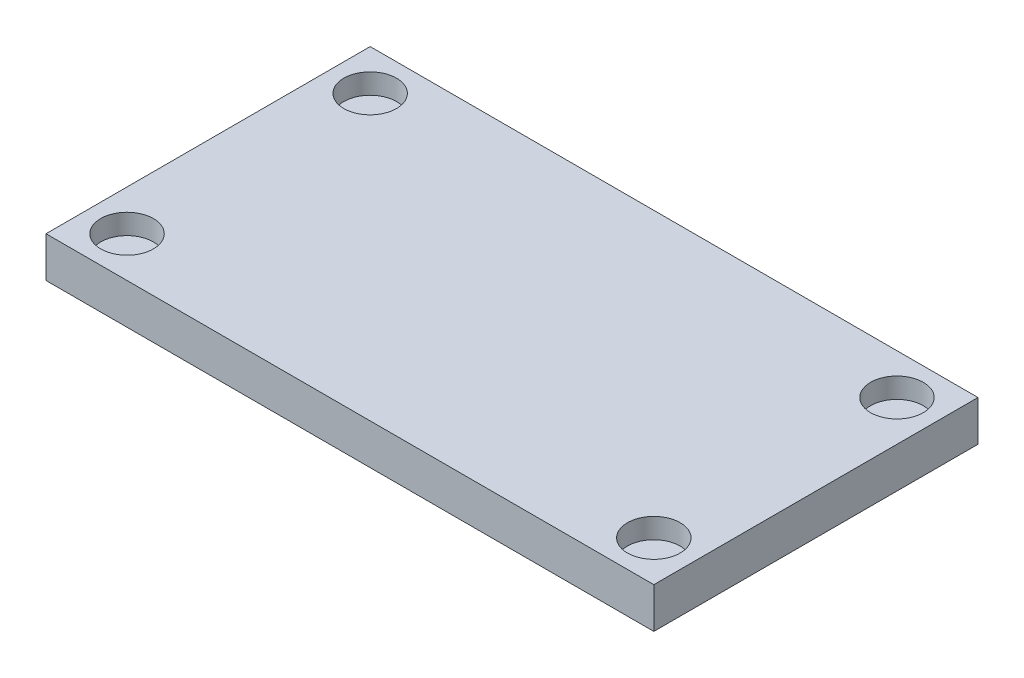
ISO-10303-21;
HEADER;
FILE_DESCRIPTION(('STEP AP214'),'2;1');
FILE_NAME('part.step','',(''),(''),'','','');
FILE_SCHEMA(('AUTOMOTIVE_DESIGN { 1 0 10303 214 1 1 1 1 }'));
ENDSEC;
DATA;
#1=APPLICATION_CONTEXT('core data for automotive mechanical design processes');
#2=APPLICATION_PROTOCOL_DEFINITION('international standard','automotive_design',2000,#1);
#3=PRODUCT_CONTEXT('',#1,'mechanical');
#4=PRODUCT('Part','Part','',(#3));
#5=PRODUCT_RELATED_PRODUCT_CATEGORY('part','',(#4));
#6=PRODUCT_DEFINITION_FORMATION('','',#4);
#7=PRODUCT_DEFINITION_CONTEXT('part definition',#1,'design');
#8=PRODUCT_DEFINITION('design','',#6,#7);
#9=PRODUCT_DEFINITION_SHAPE('','',#8);
#10=(LENGTH_UNIT() NAMED_UNIT(*) SI_UNIT(.MILLI.,.METRE.));
#11=(NAMED_UNIT(*) PLANE_ANGLE_UNIT() SI_UNIT($,.RADIAN.));
#12=(NAMED_UNIT(*) SI_UNIT($,.STERADIAN.) SOLID_ANGLE_UNIT());
#13=UNCERTAINTY_MEASURE_WITH_UNIT(LENGTH_MEASURE(1.E-05),#10,'distance_accuracy_value','');
#14=(GEOMETRIC_REPRESENTATION_CONTEXT(3) GLOBAL_UNCERTAINTY_ASSIGNED_CONTEXT((#13)) GLOBAL_UNIT_ASSIGNED_CONTEXT((#10,
#11,#12)) REPRESENTATION_CONTEXT('',''));
#15=CARTESIAN_POINT('',(0.,0.,0.));
#16=DIRECTION('',(0.,0.,1.));
#17=DIRECTION('',(1.,0.,0.));
#18=AXIS2_PLACEMENT_3D('',#15,#16,#17);
#19=CARTESIAN_POINT('',(0.,10.,0.));
#20=DIRECTION('',(0.,-1.,0.));
#21=DIRECTION('',(0.,0.,-1.));
#22=AXIS2_PLACEMENT_3D('',#19,#20,#21);
#23=PLANE('',#22);
#24=CARTESIAN_POINT('',(140.,10.,-70.));
#25=DIRECTION('',(0.,1.,0.));
#26=DIRECTION('',(0.,0.,1.));
#27=AXIS2_PLACEMENT_3D('',#24,#25,#26);
#28=CIRCLE('',#27,6.50000000000002);
#29=CARTESIAN_POINT('',(140.,10.,-63.5));
#30=VERTEX_POINT('',#29);
#31=EDGE_CURVE('E135',#30,#30,#28,.T.);
#32=ORIENTED_EDGE('',*,*,#31,.F.);
#33=EDGE_LOOP('',(#32));
#34=FACE_BOUND('',#33,.T.);
#35=CARTESIAN_POINT('',(10.,10.,-9.99999999999999));
#36=DIRECTION('',(0.,1.,0.));
#37=DIRECTION('',(0.,0.,1.));
#38=AXIS2_PLACEMENT_3D('',#35,#36,#37);
#39=CIRCLE('',#38,6.5);
#40=CARTESIAN_POINT('',(10.,10.,-3.49999999999999));
#41=VERTEX_POINT('',#40);
#42=EDGE_CURVE('E123',#41,#41,#39,.T.);
#43=ORIENTED_EDGE('',*,*,#42,.F.);
#44=EDGE_LOOP('',(#43));
#45=FACE_BOUND('',#44,.T.);
#46=DIRECTION('',(0.,0.,1.));
#47=VECTOR('',#46,1.);
#48=CARTESIAN_POINT('',(0.,10.,0.));
#49=LINE('',#48,#47);
#50=CARTESIAN_POINT('',(0.,10.,-80.));
#51=VERTEX_POINT('',#50);
#52=CARTESIAN_POINT('',(0.,10.,0.));
#53=VERTEX_POINT('',#52);
#54=EDGE_CURVE('E97',#51,#53,#49,.T.);
#55=ORIENTED_EDGE('',*,*,#54,.T.);
#56=DIRECTION('',(1.,0.,0.));
#57=VECTOR('',#56,1.);
#58=CARTESIAN_POINT('',(0.,10.,0.));
#59=LINE('',#58,#57);
#60=CARTESIAN_POINT('',(150.,10.,0.));
#61=VERTEX_POINT('',#60);
#62=EDGE_CURVE('E92',#53,#61,#59,.T.);
#63=ORIENTED_EDGE('',*,*,#62,.T.);
#64=DIRECTION('',(0.,0.,-1.));
#65=VECTOR('',#64,1.);
#66=CARTESIAN_POINT('',(150.,10.,0.));
#67=LINE('',#66,#65);
#68=CARTESIAN_POINT('',(150.,10.,-80.));
#69=VERTEX_POINT('',#68);
#70=EDGE_CURVE('E95',#61,#69,#67,.T.);
#71=ORIENTED_EDGE('',*,*,#70,.T.);
#72=DIRECTION('',(-1.,0.,0.));
#73=VECTOR('',#72,1.);
#74=CARTESIAN_POINT('',(0.,10.,-80.));
#75=LINE('',#74,#73);
#76=EDGE_CURVE('E62',#69,#51,#75,.T.);
#77=ORIENTED_EDGE('',*,*,#76,.T.);
#78=EDGE_LOOP('',(#55,#63,#71,#77));
#79=FACE_BOUND('',#78,.T.);
#80=CARTESIAN_POINT('',(10.,10.,-70.));
#81=DIRECTION('',(0.,1.,0.));
#82=DIRECTION('',(0.,0.,1.));
#83=AXIS2_PLACEMENT_3D('',#80,#81,#82);
#84=CIRCLE('',#83,6.5);
#85=CARTESIAN_POINT('',(10.,10.,-63.5));
#86=VERTEX_POINT('',#85);
#87=EDGE_CURVE('E141',#86,#86,#84,.F.);
#88=ORIENTED_EDGE('',*,*,#87,.T.);
#89=EDGE_LOOP('',(#88));
#90=FACE_BOUND('',#89,.T.);
#91=CARTESIAN_POINT('',(140.,10.,-9.99999999999999));
#92=DIRECTION('',(0.,1.,0.));
#93=DIRECTION('',(0.,0.,1.));
#94=AXIS2_PLACEMENT_3D('',#91,#92,#93);
#95=CIRCLE('',#94,6.50000000000002);
#96=CARTESIAN_POINT('',(140.,10.,-3.49999999999998));
#97=VERTEX_POINT('',#96);
#98=EDGE_CURVE('E129',#97,#97,#95,.F.);
#99=ORIENTED_EDGE('',*,*,#98,.T.);
#100=EDGE_LOOP('',(#99));
#101=FACE_BOUND('',#100,.T.);
#102=ADVANCED_FACE('F45',(#34,#45,#79,#90,#101),#23,.F.);
#103=CARTESIAN_POINT('',(0.,10.,0.));
#104=DIRECTION('',(1.,0.,0.));
#105=DIRECTION('',(0.,0.,-1.));
#106=AXIS2_PLACEMENT_3D('',#103,#104,#105);
#107=PLANE('',#106);
#108=DIRECTION('',(0.,0.,1.));
#109=VECTOR('',#108,1.);
#110=CARTESIAN_POINT('',(0.,0.,0.));
#111=LINE('',#110,#109);
#112=CARTESIAN_POINT('',(0.,0.,-80.));
#113=VERTEX_POINT('',#112);
#114=CARTESIAN_POINT('',(0.,0.,0.));
#115=VERTEX_POINT('',#114);
#116=EDGE_CURVE('E109',#113,#115,#111,.T.);
#117=ORIENTED_EDGE('',*,*,#116,.T.);
#118=DIRECTION('',(0.,-1.,0.));
#119=VECTOR('',#118,1.);
#120=CARTESIAN_POINT('',(0.,10.,0.));
#121=LINE('',#120,#119);
#122=EDGE_CURVE('E11',#53,#115,#121,.T.);
#123=ORIENTED_EDGE('',*,*,#122,.F.);
#124=ORIENTED_EDGE('',*,*,#54,.F.);
#125=DIRECTION('',(0.,-1.,0.));
#126=VECTOR('',#125,1.);
#127=CARTESIAN_POINT('',(0.,10.,-80.));
#128=LINE('',#127,#126);
#129=EDGE_CURVE('E105',#51,#113,#128,.T.);
#130=ORIENTED_EDGE('',*,*,#129,.T.);
#131=EDGE_LOOP('',(#117,#123,#124,#130));
#132=FACE_BOUND('',#131,.T.);
#133=ADVANCED_FACE('F47',(#132),#107,.F.);
#134=CARTESIAN_POINT('',(0.,10.,0.));
#135=DIRECTION('',(0.,0.,-1.));
#136=DIRECTION('',(-1.,0.,0.));
#137=AXIS2_PLACEMENT_3D('',#134,#135,#136);
#138=PLANE('',#137);
#139=DIRECTION('',(1.,0.,0.));
#140=VECTOR('',#139,1.);
#141=CARTESIAN_POINT('',(0.,0.,0.));
#142=LINE('',#141,#140);
#143=CARTESIAN_POINT('',(150.,0.,0.));
#144=VERTEX_POINT('',#143);
#145=EDGE_CURVE('E101',#115,#144,#142,.T.);
#146=ORIENTED_EDGE('',*,*,#145,.T.);
#147=DIRECTION('',(0.,-1.,0.));
#148=VECTOR('',#147,1.);
#149=CARTESIAN_POINT('',(150.,10.,0.));
#150=LINE('',#149,#148);
#151=EDGE_CURVE('E54',#61,#144,#150,.T.);
#152=ORIENTED_EDGE('',*,*,#151,.F.);
#153=ORIENTED_EDGE('',*,*,#62,.F.);
#154=ORIENTED_EDGE('',*,*,#122,.T.);
#155=EDGE_LOOP('',(#146,#152,#153,#154));
#156=FACE_BOUND('',#155,.T.);
#157=ADVANCED_FACE('F100',(#156),#138,.F.);
#158=CARTESIAN_POINT('',(150.,10.,0.));
#159=DIRECTION('',(-1.,0.,0.));
#160=DIRECTION('',(0.,0.,1.));
#161=AXIS2_PLACEMENT_3D('',#158,#159,#160);
#162=PLANE('',#161);
#163=DIRECTION('',(0.,0.,-1.));
#164=VECTOR('',#163,1.);
#165=CARTESIAN_POINT('',(150.,0.,0.));
#166=LINE('',#165,#164);
#167=CARTESIAN_POINT('',(150.,0.,-80.));
#168=VERTEX_POINT('',#167);
#169=EDGE_CURVE('E79',#144,#168,#166,.T.);
#170=ORIENTED_EDGE('',*,*,#169,.T.);
#171=DIRECTION('',(0.,-1.,0.));
#172=VECTOR('',#171,1.);
#173=CARTESIAN_POINT('',(150.,10.,-80.));
#174=LINE('',#173,#172);
#175=EDGE_CURVE('E102',#69,#168,#174,.T.);
#176=ORIENTED_EDGE('',*,*,#175,.F.);
#177=ORIENTED_EDGE('',*,*,#70,.F.);
#178=ORIENTED_EDGE('',*,*,#151,.T.);
#179=EDGE_LOOP('',(#170,#176,#177,#178));
#180=FACE_BOUND('',#179,.T.);
#181=ADVANCED_FACE('F103',(#180),#162,.F.);
#182=CARTESIAN_POINT('',(0.,10.,-80.));
#183=DIRECTION('',(0.,0.,1.));
#184=DIRECTION('',(1.,0.,0.));
#185=AXIS2_PLACEMENT_3D('',#182,#183,#184);
#186=PLANE('',#185);
#187=DIRECTION('',(-1.,0.,0.));
#188=VECTOR('',#187,1.);
#189=CARTESIAN_POINT('',(0.,0.,-80.));
#190=LINE('',#189,#188);
#191=EDGE_CURVE('E85',#168,#113,#190,.T.);
#192=ORIENTED_EDGE('',*,*,#191,.T.);
#193=ORIENTED_EDGE('',*,*,#129,.F.);
#194=ORIENTED_EDGE('',*,*,#76,.F.);
#195=ORIENTED_EDGE('',*,*,#175,.T.);
#196=EDGE_LOOP('',(#192,#193,#194,#195));
#197=FACE_BOUND('',#196,.T.);
#198=ADVANCED_FACE('F117',(#197),#186,.F.);
#199=CARTESIAN_POINT('',(0.,0.,0.));
#200=DIRECTION('',(0.,-1.,0.));
#201=DIRECTION('',(0.,0.,-1.));
#202=AXIS2_PLACEMENT_3D('',#199,#200,#201);
#203=PLANE('',#202);
#204=ORIENTED_EDGE('',*,*,#116,.F.);
#205=ORIENTED_EDGE('',*,*,#191,.F.);
#206=ORIENTED_EDGE('',*,*,#169,.F.);
#207=ORIENTED_EDGE('',*,*,#145,.F.);
#208=EDGE_LOOP('',(#204,#205,#206,#207));
#209=FACE_BOUND('',#208,.T.);
#210=ADVANCED_FACE('F120',(#209),#203,.T.);
#211=CARTESIAN_POINT('',(10.,5.,-9.99999999999999));
#212=DIRECTION('',(0.,1.,0.));
#213=DIRECTION('',(0.,0.,1.));
#214=AXIS2_PLACEMENT_3D('',#211,#212,#213);
#215=CYLINDRICAL_SURFACE('',#214,6.5);
#216=CARTESIAN_POINT('',(10.,5.,-9.99999999999999));
#217=DIRECTION('',(0.,1.,0.));
#218=DIRECTION('',(0.,0.,1.));
#219=AXIS2_PLACEMENT_3D('',#216,#217,#218);
#220=CIRCLE('',#219,6.5);
#221=CARTESIAN_POINT('',(10.,5.,-3.49999999999999));
#222=VERTEX_POINT('',#221);
#223=EDGE_CURVE('E112',#222,#222,#220,.T.);
#224=ORIENTED_EDGE('',*,*,#223,.F.);
#225=EDGE_LOOP('',(#224));
#226=FACE_BOUND('',#225,.T.);
#227=ORIENTED_EDGE('',*,*,#42,.T.);
#228=EDGE_LOOP('',(#227));
#229=FACE_BOUND('',#228,.T.);
#230=ADVANCED_FACE('F175',(#226,#229),#215,.F.);
#231=CARTESIAN_POINT('',(0.,5.,0.));
#232=DIRECTION('',(0.,1.,0.));
#233=DIRECTION('',(0.,0.,1.));
#234=AXIS2_PLACEMENT_3D('',#231,#232,#233);
#235=PLANE('',#234);
#236=ORIENTED_EDGE('',*,*,#223,.T.);
#237=EDGE_LOOP('',(#236));
#238=FACE_BOUND('',#237,.T.);
#239=ADVANCED_FACE('F161',(#238),#235,.T.);
#240=CARTESIAN_POINT('',(10.,5.,-70.));
#241=DIRECTION('',(0.,1.,0.));
#242=DIRECTION('',(0.,0.,1.));
#243=AXIS2_PLACEMENT_3D('',#240,#241,#242);
#244=CYLINDRICAL_SURFACE('',#243,6.5);
#245=CARTESIAN_POINT('',(10.,5.,-70.));
#246=DIRECTION('',(0.,1.,0.));
#247=DIRECTION('',(0.,0.,1.));
#248=AXIS2_PLACEMENT_3D('',#245,#246,#247);
#249=CIRCLE('',#248,6.5);
#250=CARTESIAN_POINT('',(10.,5.,-63.5));
#251=VERTEX_POINT('',#250);
#252=EDGE_CURVE('E126',#251,#251,#249,.F.);
#253=ORIENTED_EDGE('',*,*,#252,.T.);
#254=EDGE_LOOP('',(#253));
#255=FACE_BOUND('',#254,.T.);
#256=ORIENTED_EDGE('',*,*,#87,.F.);
#257=EDGE_LOOP('',(#256));
#258=FACE_BOUND('',#257,.T.);
#259=ADVANCED_FACE('F147',(#255,#258),#244,.F.);
#260=CARTESIAN_POINT('',(0.,5.,0.));
#261=DIRECTION('',(0.,1.,0.));
#262=DIRECTION('',(0.,0.,1.));
#263=AXIS2_PLACEMENT_3D('',#260,#261,#262);
#264=PLANE('',#263);
#265=ORIENTED_EDGE('',*,*,#252,.F.);
#266=EDGE_LOOP('',(#265));
#267=FACE_BOUND('',#266,.T.);
#268=ADVANCED_FACE('F150',(#267),#264,.T.);
#269=CARTESIAN_POINT('',(140.,5.,-70.));
#270=DIRECTION('',(0.,1.,0.));
#271=DIRECTION('',(0.,0.,1.));
#272=AXIS2_PLACEMENT_3D('',#269,#270,#271);
#273=CYLINDRICAL_SURFACE('',#272,6.50000000000002);
#274=CARTESIAN_POINT('',(140.,5.,-70.));
#275=DIRECTION('',(0.,1.,0.));
#276=DIRECTION('',(0.,0.,1.));
#277=AXIS2_PLACEMENT_3D('',#274,#275,#276);
#278=CIRCLE('',#277,6.50000000000002);
#279=CARTESIAN_POINT('',(140.,5.,-63.5));
#280=VERTEX_POINT('',#279);
#281=EDGE_CURVE('E138',#280,#280,#278,.T.);
#282=ORIENTED_EDGE('',*,*,#281,.F.);
#283=EDGE_LOOP('',(#282));
#284=FACE_BOUND('',#283,.T.);
#285=ORIENTED_EDGE('',*,*,#31,.T.);
#286=EDGE_LOOP('',(#285));
#287=FACE_BOUND('',#286,.T.);
#288=ADVANCED_FACE('F152',(#284,#287),#273,.F.);
#289=CARTESIAN_POINT('',(0.,5.,0.));
#290=DIRECTION('',(0.,1.,0.));
#291=DIRECTION('',(0.,0.,1.));
#292=AXIS2_PLACEMENT_3D('',#289,#290,#291);
#293=PLANE('',#292);
#294=ORIENTED_EDGE('',*,*,#281,.T.);
#295=EDGE_LOOP('',(#294));
#296=FACE_BOUND('',#295,.T.);
#297=ADVANCED_FACE('F158',(#296),#293,.T.);
#298=CARTESIAN_POINT('',(140.,5.,-9.99999999999999));
#299=DIRECTION('',(0.,1.,0.));
#300=DIRECTION('',(0.,0.,1.));
#301=AXIS2_PLACEMENT_3D('',#298,#299,#300);
#302=CYLINDRICAL_SURFACE('',#301,6.50000000000002);
#303=CARTESIAN_POINT('',(140.,5.,-9.99999999999999));
#304=DIRECTION('',(0.,1.,0.));
#305=DIRECTION('',(0.,0.,1.));
#306=AXIS2_PLACEMENT_3D('',#303,#304,#305);
#307=CIRCLE('',#306,6.50000000000002);
#308=CARTESIAN_POINT('',(140.,5.,-3.49999999999998));
#309=VERTEX_POINT('',#308);
#310=EDGE_CURVE('E132',#309,#309,#307,.F.);
#311=ORIENTED_EDGE('',*,*,#310,.T.);
#312=EDGE_LOOP('',(#311));
#313=FACE_BOUND('',#312,.T.);
#314=ORIENTED_EDGE('',*,*,#98,.F.);
#315=EDGE_LOOP('',(#314));
#316=FACE_BOUND('',#315,.T.);
#317=ADVANCED_FACE('F246',(#313,#316),#302,.F.);
#318=CARTESIAN_POINT('',(0.,5.,0.));
#319=DIRECTION('',(0.,1.,0.));
#320=DIRECTION('',(0.,0.,1.));
#321=AXIS2_PLACEMENT_3D('',#318,#319,#320);
#322=PLANE('',#321);
#323=ORIENTED_EDGE('',*,*,#310,.F.);
#324=EDGE_LOOP('',(#323));
#325=FACE_BOUND('',#324,.T.);
#326=ADVANCED_FACE('F256',(#325),#322,.T.);
#327=CLOSED_SHELL('',(#102,#133,#157,#181,#198,#210,#230,#239,#259,#268,#288,#297,#317,#326));
#328=MANIFOLD_SOLID_BREP('B2',#327);
#329=ADVANCED_BREP_SHAPE_REPRESENTATION('',(#18,#328),#14);
#330=SHAPE_DEFINITION_REPRESENTATION(#9,#329);
ENDSEC;
END-ISO-10303-21;
